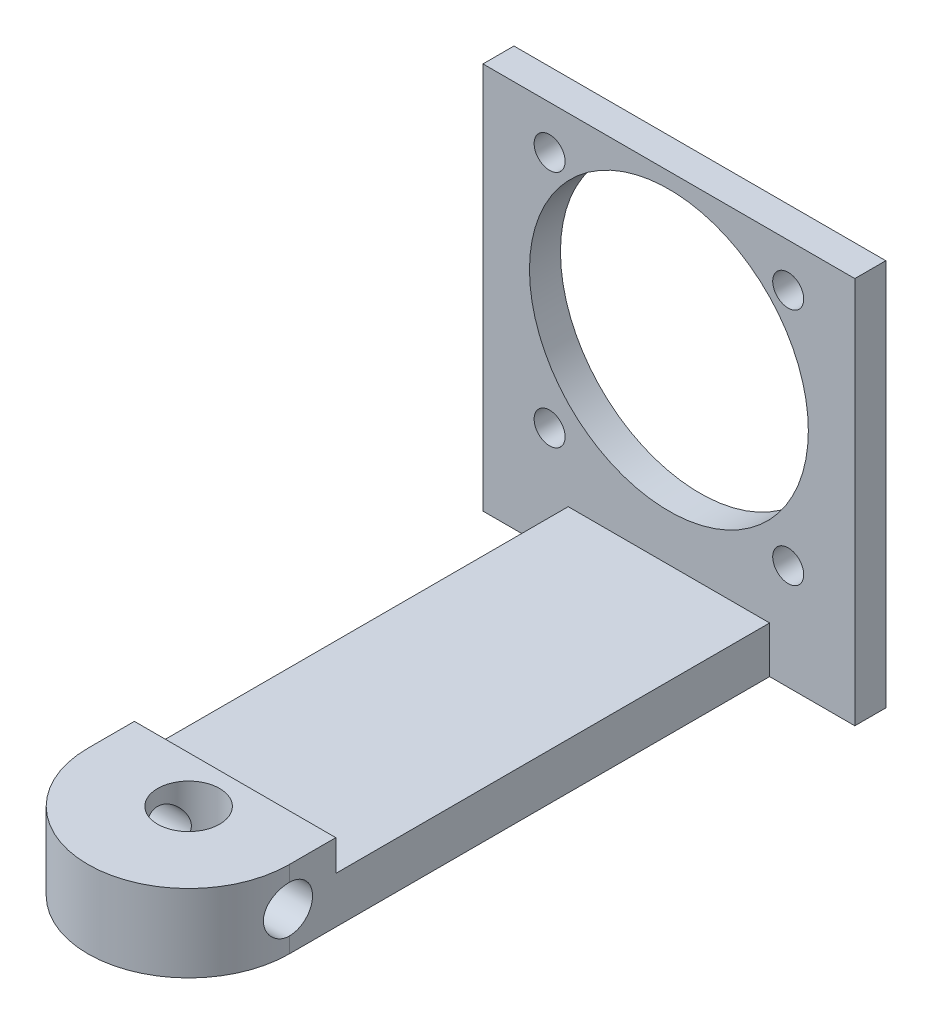
ISO-10303-21;
HEADER;
FILE_DESCRIPTION(('STEP AP214'),'2;1');
FILE_NAME('part.step','',(''),(''),'','','');
FILE_SCHEMA(('AUTOMOTIVE_DESIGN { 1 0 10303 214 1 1 1 1 }'));
ENDSEC;
DATA;
#1=APPLICATION_CONTEXT('core data for automotive mechanical design processes');
#2=APPLICATION_PROTOCOL_DEFINITION('international standard','automotive_design',2000,#1);
#3=PRODUCT_CONTEXT('',#1,'mechanical');
#4=PRODUCT('Part','Part','',(#3));
#5=PRODUCT_RELATED_PRODUCT_CATEGORY('part','',(#4));
#6=PRODUCT_DEFINITION_FORMATION('','',#4);
#7=PRODUCT_DEFINITION_CONTEXT('part definition',#1,'design');
#8=PRODUCT_DEFINITION('design','',#6,#7);
#9=PRODUCT_DEFINITION_SHAPE('','',#8);
#10=(LENGTH_UNIT() NAMED_UNIT(*) SI_UNIT(.MILLI.,.METRE.));
#11=(NAMED_UNIT(*) PLANE_ANGLE_UNIT() SI_UNIT($,.RADIAN.));
#12=(NAMED_UNIT(*) SI_UNIT($,.STERADIAN.) SOLID_ANGLE_UNIT());
#13=UNCERTAINTY_MEASURE_WITH_UNIT(LENGTH_MEASURE(1.E-05),#10,'distance_accuracy_value','');
#14=(GEOMETRIC_REPRESENTATION_CONTEXT(3) GLOBAL_UNCERTAINTY_ASSIGNED_CONTEXT((#13)) GLOBAL_UNIT_ASSIGNED_CONTEXT((#10,
#11,#12)) REPRESENTATION_CONTEXT('',''));
#15=CARTESIAN_POINT('',(0.,0.,0.));
#16=DIRECTION('',(0.,0.,1.));
#17=DIRECTION('',(1.,0.,0.));
#18=AXIS2_PLACEMENT_3D('',#15,#16,#17);
#19=CARTESIAN_POINT('',(0.,5.,0.));
#20=DIRECTION('',(0.,-1.,0.));
#21=DIRECTION('',(0.,0.,-1.));
#22=AXIS2_PLACEMENT_3D('',#19,#20,#21);
#23=CYLINDRICAL_SURFACE('',#22,6.5);
#24=DIRECTION('',(0.,1.,0.));
#25=VECTOR('',#24,1.);
#26=CARTESIAN_POINT('',(-6.5,0.,0.));
#27=LINE('',#26,#25);
#28=CARTESIAN_POINT('',(-6.5,4.,0.));
#29=VERTEX_POINT('',#28);
#30=CARTESIAN_POINT('',(-6.5,5.,0.));
#31=VERTEX_POINT('',#30);
#32=EDGE_CURVE('E256',#29,#31,#27,.T.);
#33=ORIENTED_EDGE('',*,*,#32,.F.);
#34=CARTESIAN_POINT('',(-6.5,4.,0.));
#35=CARTESIAN_POINT('',(-6.50000220165452,4.00000034953334,0.0416147872954959));
#36=CARTESIAN_POINT('',(-6.49959986400161,3.99826710539507,0.0832091199490759));
#37=CARTESIAN_POINT('',(-6.49800953430171,3.99135662834144,0.166089757544733));
#38=CARTESIAN_POINT('',(-6.49682165266363,3.98617987941311,0.207376104949849));
#39=CARTESIAN_POINT('',(-6.49212286566449,3.96555451840419,0.330175317789648));
#40=CARTESIAN_POINT('',(-6.48747657447072,3.94501050646884,0.410849123483653));
#41=CARTESIAN_POINT('',(-6.47565784186475,3.89098207029547,0.567489317574778));
#42=CARTESIAN_POINT('',(-6.46848532076805,3.85749723786392,0.643455557392986));
#43=CARTESIAN_POINT('',(-6.45238470693778,3.77857602400352,0.7887168337292));
#44=CARTESIAN_POINT('',(-6.44345630747166,3.73313755393742,0.858010701502618));
#45=CARTESIAN_POINT('',(-6.42464362628356,3.63075675821594,0.989150748038431));
#46=CARTESIAN_POINT('',(-6.41474648283068,3.57364419902096,1.05086213099954));
#47=CARTESIAN_POINT('',(-6.39519936402326,3.44989542172784,1.16392621182314));
#48=CARTESIAN_POINT('',(-6.38554943278192,3.38325751766964,1.21527707201301));
#49=CARTESIAN_POINT('',(-6.36746150102323,3.2413311694577,1.30676825801418));
#50=CARTESIAN_POINT('',(-6.35904004454769,3.1659455490244,1.34676139941763));
#51=CARTESIAN_POINT('',(-6.34455013648216,3.00930058518296,1.41345535385357));
#52=CARTESIAN_POINT('',(-6.33848124461369,2.92804234420635,1.4401586543231));
#53=CARTESIAN_POINT('',(-6.32951539761228,2.76343513777675,1.47906402551188));
#54=CARTESIAN_POINT('',(-6.32656563823779,2.68014624207401,1.49150781160661));
#55=CARTESIAN_POINT('',(-6.32401364085923,2.51261284883344,1.50229310584037));
#56=CARTESIAN_POINT('',(-6.32441101948296,2.42836846183881,1.50063622903126));
#57=CARTESIAN_POINT('',(-6.32846084145958,2.26313685146556,1.48346059952456));
#58=CARTESIAN_POINT('',(-6.33204664255201,2.18211824518399,1.46822563187731));
#59=CARTESIAN_POINT('',(-6.34196356616616,2.02381956619207,1.4247771750235));
#60=CARTESIAN_POINT('',(-6.34829483549844,1.94653969365162,1.39656299176435));
#61=CARTESIAN_POINT('',(-6.36305342295416,1.79712631388062,1.32770304404165));
#62=CARTESIAN_POINT('',(-6.37149866245093,1.72504396921276,1.28695026840391));
#63=CARTESIAN_POINT('',(-6.38952265626135,1.58863901043529,1.1942459969747));
#64=CARTESIAN_POINT('',(-6.39910155080027,1.52431735826085,1.14229311515341));
#65=CARTESIAN_POINT('',(-6.41859659909107,1.4036333728504,1.02718049087355));
#66=CARTESIAN_POINT('',(-6.42851532395215,1.34749962191238,0.963781307071192));
#67=CARTESIAN_POINT('',(-6.44736600364968,1.24660761938418,0.82833476980019));
#68=CARTESIAN_POINT('',(-6.45629769992504,1.20185234451434,0.756285160538791));
#69=CARTESIAN_POINT('',(-6.47220381480734,1.12491899722735,0.605275941064463));
#70=CARTESIAN_POINT('',(-6.47917205030647,1.09278053401099,0.526295506847693));
#71=CARTESIAN_POINT('',(-6.49031294619121,1.04233883410384,0.363906168610026));
#72=CARTESIAN_POINT('',(-6.49448971158766,1.02401527672575,0.280503962867058));
#73=CARTESIAN_POINT('',(-6.49802162790796,1.008592607797,0.163668895100916));
#74=CARTESIAN_POINT('',(-6.49876264230996,1.00536952773524,0.130994416113086));
#75=CARTESIAN_POINT('',(-6.49975148978194,1.00107578893315,0.0655516850819211));
#76=CARTESIAN_POINT('',(-6.50000014424018,1.00000154532742,0.0327836807001354));
#77=CARTESIAN_POINT('',(-6.5,0.999999999999993,0.));
#78=B_SPLINE_CURVE_WITH_KNOTS('',3,(#34,#35,#36,#37,#38,#39,#40,#41,#42,#43,#44,#45,#46,#47,#48,
#49,#50,#51,#52,#53,#54,#55,#56,#57,#58,#59,#60,#61,#62,#63,#64,#65,#66,#67,#68,#69,#70,#71,#72,
#73,#74,#75,#76,#77),.UNSPECIFIED.,.F.,.F.,(4,2,2,2,2,2,2,2,2,2,2,2,2,2,2,2,2,2,2,2,2,4),(0.,
0.124766007489179,0.249514482732316,0.49835772355059,0.74720881429561,0.996103415249857,
1.24892599960295,1.50179338840207,1.75780196475339,2.01376260637538,2.26531706657213,
2.51684271478785,2.76323158330048,3.00963362878159,3.25819984550211,3.50679684033752,
3.76137162291094,4.01601293635863,4.2714473969798,4.52650539572824,4.62497109867903,
4.72327239560029),.UNSPECIFIED.);
#79=CARTESIAN_POINT('',(-6.5,1.,0.));
#80=VERTEX_POINT('',#79);
#81=EDGE_CURVE('E88',#29,#80,#78,.T.);
#82=ORIENTED_EDGE('',*,*,#81,.T.);
#83=CARTESIAN_POINT('',(-6.5,0.,0.));
#84=VERTEX_POINT('',#83);
#85=EDGE_CURVE('E261',#84,#80,#27,.T.);
#86=ORIENTED_EDGE('',*,*,#85,.F.);
#87=CARTESIAN_POINT('',(0.,0.,0.));
#88=DIRECTION('',(0.,1.,0.));
#89=DIRECTION('',(0.,0.,1.));
#90=AXIS2_PLACEMENT_3D('',#87,#88,#89);
#91=CIRCLE('',#90,6.5);
#92=CARTESIAN_POINT('',(6.5,0.,0.));
#93=VERTEX_POINT('',#92);
#94=EDGE_CURVE('E276',#84,#93,#91,.T.);
#95=ORIENTED_EDGE('',*,*,#94,.T.);
#96=DIRECTION('',(0.,1.,0.));
#97=VECTOR('',#96,1.);
#98=CARTESIAN_POINT('',(6.5,0.,0.));
#99=LINE('',#98,#97);
#100=CARTESIAN_POINT('',(6.5,1.,0.));
#101=VERTEX_POINT('',#100);
#102=EDGE_CURVE('E270',#93,#101,#99,.T.);
#103=ORIENTED_EDGE('',*,*,#102,.T.);
#104=CARTESIAN_POINT('',(6.5,1.,0.));
#105=CARTESIAN_POINT('',(6.50000220165452,0.999999650466661,0.0416147872954943));
#106=CARTESIAN_POINT('',(6.49959986400161,1.00173289460494,0.0832091199490743));
#107=CARTESIAN_POINT('',(6.49800953430171,1.00864337165856,0.166089757544732));
#108=CARTESIAN_POINT('',(6.49682165266363,1.01382012058689,0.207376104949847));
#109=CARTESIAN_POINT('',(6.49212286566449,1.03444548159581,0.330175317789646));
#110=CARTESIAN_POINT('',(6.48747657447072,1.05498949353116,0.410849123483651));
#111=CARTESIAN_POINT('',(6.47565784186475,1.10901792970453,0.567489317574776));
#112=CARTESIAN_POINT('',(6.46848532076805,1.14250276213608,0.643455557392984));
#113=CARTESIAN_POINT('',(6.45238470693778,1.22142397599648,0.788716833729199));
#114=CARTESIAN_POINT('',(6.44345630747166,1.26686244606258,0.858010701502617));
#115=CARTESIAN_POINT('',(6.42464362628356,1.36924324178406,0.98915074803843));
#116=CARTESIAN_POINT('',(6.41474648283068,1.42635580097904,1.05086213099954));
#117=CARTESIAN_POINT('',(6.39519936402326,1.55010457827216,1.16392621182314));
#118=CARTESIAN_POINT('',(6.38554943278192,1.61674248233036,1.215277072013));
#119=CARTESIAN_POINT('',(6.36746150102323,1.75866883054229,1.30676825801418));
#120=CARTESIAN_POINT('',(6.35904004454769,1.8340544509756,1.34676139941763));
#121=CARTESIAN_POINT('',(6.34455013648216,1.99069941481704,1.41345535385357));
#122=CARTESIAN_POINT('',(6.33848124461369,2.07195765579365,1.4401586543231));
#123=CARTESIAN_POINT('',(6.32951539761228,2.23656486222325,1.47906402551188));
#124=CARTESIAN_POINT('',(6.32656563823779,2.31985375792599,1.49150781160661));
#125=CARTESIAN_POINT('',(6.32401364085923,2.48738715116656,1.50229310584037));
#126=CARTESIAN_POINT('',(6.32441101948296,2.57163153816119,1.50063622903126));
#127=CARTESIAN_POINT('',(6.32846084145958,2.73686314853444,1.48346059952456));
#128=CARTESIAN_POINT('',(6.33204664255201,2.81788175481601,1.46822563187731));
#129=CARTESIAN_POINT('',(6.34196356616616,2.97618043380792,1.4247771750235));
#130=CARTESIAN_POINT('',(6.34829483549844,3.05346030634837,1.39656299176435));
#131=CARTESIAN_POINT('',(6.36305342295416,3.20287368611938,1.32770304404165));
#132=CARTESIAN_POINT('',(6.37149866245093,3.27495603078724,1.28695026840391));
#133=CARTESIAN_POINT('',(6.38952265626135,3.41136098956471,1.1942459969747));
#134=CARTESIAN_POINT('',(6.39910155080027,3.47568264173915,1.14229311515341));
#135=CARTESIAN_POINT('',(6.41859659909107,3.5963666271496,1.02718049087355));
#136=CARTESIAN_POINT('',(6.42851532395215,3.65250037808762,0.963781307071193));
#137=CARTESIAN_POINT('',(6.44736600364968,3.75339238061581,0.828334769800191));
#138=CARTESIAN_POINT('',(6.45629769992504,3.79814765548566,0.756285160538792));
#139=CARTESIAN_POINT('',(6.47220381480734,3.87508100277265,0.605275941064464));
#140=CARTESIAN_POINT('',(6.47917205030647,3.90721946598901,0.526295506847694));
#141=CARTESIAN_POINT('',(6.49031294619121,3.95766116589616,0.363906168610028));
#142=CARTESIAN_POINT('',(6.49448971158766,3.97598472327425,0.28050396286706));
#143=CARTESIAN_POINT('',(6.49802162790796,3.991407392203,0.163668895100917));
#144=CARTESIAN_POINT('',(6.49876264230996,3.99463047226476,0.130994416113087));
#145=CARTESIAN_POINT('',(6.49975148978194,3.99892421106685,0.0655516850819207));
#146=CARTESIAN_POINT('',(6.50000014424018,3.99999845467258,0.0327836807001345));
#147=CARTESIAN_POINT('',(6.5,4.00000000000001,0.));
#148=B_SPLINE_CURVE_WITH_KNOTS('',3,(#104,#105,#106,#107,#108,#109,#110,#111,#112,#113,#114,
#115,#116,#117,#118,#119,#120,#121,#122,#123,#124,#125,#126,#127,#128,#129,#130,#131,#132,#133,
#134,#135,#136,#137,#138,#139,#140,#141,#142,#143,#144,#145,#146,#147),.UNSPECIFIED.,.F.,.F.,(4,
2,2,2,2,2,2,2,2,2,2,2,2,2,2,2,2,2,2,2,2,4),(0.,0.124766007489179,0.249514482732316,
0.49835772355059,0.74720881429561,0.996103415249857,1.24892599960295,1.50179338840207,
1.75780196475339,2.01376260637538,2.26531706657213,2.51684271478785,2.76323158330048,
3.00963362878159,3.25819984550211,3.50679684033752,3.76137162291094,4.01601293635863,
4.2714473969798,4.52650539572824,4.62497109867903,4.72327239560029),.UNSPECIFIED.);
#149=CARTESIAN_POINT('',(6.5,4.,0.));
#150=VERTEX_POINT('',#149);
#151=EDGE_CURVE('E81',#101,#150,#148,.T.);
#152=ORIENTED_EDGE('',*,*,#151,.T.);
#153=CARTESIAN_POINT('',(6.5,5.,0.));
#154=VERTEX_POINT('',#153);
#155=EDGE_CURVE('E266',#150,#154,#99,.T.);
#156=ORIENTED_EDGE('',*,*,#155,.T.);
#157=CARTESIAN_POINT('',(0.,5.,0.));
#158=DIRECTION('',(0.,1.,0.));
#159=DIRECTION('',(0.,0.,1.));
#160=AXIS2_PLACEMENT_3D('',#157,#158,#159);
#161=CIRCLE('',#160,6.5);
#162=EDGE_CURVE('E75',#31,#154,#161,.T.);
#163=ORIENTED_EDGE('',*,*,#162,.F.);
#164=EDGE_LOOP('',(#33,#82,#86,#95,#103,#152,#156,#163));
#165=FACE_BOUND('',#164,.T.);
#166=ADVANCED_FACE('F66',(#165),#23,.T.);
#167=CARTESIAN_POINT('',(0.,5.,0.));
#168=DIRECTION('',(0.,1.,0.));
#169=DIRECTION('',(0.,0.,1.));
#170=AXIS2_PLACEMENT_3D('',#167,#168,#169);
#171=PLANE('',#170);
#172=DIRECTION('',(1.,0.,0.));
#173=VECTOR('',#172,1.);
#174=CARTESIAN_POINT('',(-6.5,5.,-3.));
#175=LINE('',#174,#173);
#176=CARTESIAN_POINT('',(-6.5,5.,-3.));
#177=VERTEX_POINT('',#176);
#178=CARTESIAN_POINT('',(6.5,5.,-3.));
#179=VERTEX_POINT('',#178);
#180=EDGE_CURVE('E176',#177,#179,#175,.T.);
#181=ORIENTED_EDGE('',*,*,#180,.F.);
#182=DIRECTION('',(0.,0.,-1.));
#183=VECTOR('',#182,1.);
#184=CARTESIAN_POINT('',(-6.5,5.,0.));
#185=LINE('',#184,#183);
#186=EDGE_CURVE('E181',#31,#177,#185,.T.);
#187=ORIENTED_EDGE('',*,*,#186,.F.);
#188=ORIENTED_EDGE('',*,*,#162,.T.);
#189=DIRECTION('',(0.,0.,-1.));
#190=VECTOR('',#189,1.);
#191=CARTESIAN_POINT('',(6.5,5.,0.));
#192=LINE('',#191,#190);
#193=EDGE_CURVE('E300',#154,#179,#192,.T.);
#194=ORIENTED_EDGE('',*,*,#193,.T.);
#195=EDGE_LOOP('',(#181,#187,#188,#194));
#196=FACE_BOUND('',#195,.T.);
#197=CARTESIAN_POINT('',(0.,5.,0.));
#198=DIRECTION('',(0.,1.,0.));
#199=DIRECTION('',(0.,0.,1.));
#200=AXIS2_PLACEMENT_3D('',#197,#198,#199);
#201=CIRCLE('',#200,2.);
#202=CARTESIAN_POINT('',(0.,5.,2.));
#203=VERTEX_POINT('',#202);
#204=EDGE_CURVE('E277',#203,#203,#201,.T.);
#205=ORIENTED_EDGE('',*,*,#204,.F.);
#206=EDGE_LOOP('',(#205));
#207=FACE_BOUND('',#206,.T.);
#208=ADVANCED_FACE('F239',(#196,#207),#171,.T.);
#209=CARTESIAN_POINT('',(0.,0.,0.));
#210=DIRECTION('',(0.,1.,0.));
#211=DIRECTION('',(0.,0.,1.));
#212=AXIS2_PLACEMENT_3D('',#209,#210,#211);
#213=PLANE('',#212);
#214=CARTESIAN_POINT('',(0.,0.,0.));
#215=DIRECTION('',(0.,1.,0.));
#216=DIRECTION('',(0.,0.,1.));
#217=AXIS2_PLACEMENT_3D('',#214,#215,#216);
#218=CIRCLE('',#217,2.);
#219=CARTESIAN_POINT('',(0.,0.,2.));
#220=VERTEX_POINT('',#219);
#221=EDGE_CURVE('E273',#220,#220,#218,.T.);
#222=ORIENTED_EDGE('',*,*,#221,.T.);
#223=EDGE_LOOP('',(#222));
#224=FACE_BOUND('',#223,.T.);
#225=ORIENTED_EDGE('',*,*,#94,.F.);
#226=DIRECTION('',(0.,0.,-1.));
#227=VECTOR('',#226,1.);
#228=CARTESIAN_POINT('',(-6.5,0.,0.));
#229=LINE('',#228,#227);
#230=CARTESIAN_POINT('',(-6.5,0.,-31.));
#231=VERTEX_POINT('',#230);
#232=EDGE_CURVE('E297',#84,#231,#229,.T.);
#233=ORIENTED_EDGE('',*,*,#232,.T.);
#234=DIRECTION('',(-1.,0.,0.));
#235=VECTOR('',#234,1.);
#236=CARTESIAN_POINT('',(0.,0.,-31.));
#237=LINE('',#236,#235);
#238=CARTESIAN_POINT('',(-12.,0.,-31.));
#239=VERTEX_POINT('',#238);
#240=EDGE_CURVE('E316',#231,#239,#237,.T.);
#241=ORIENTED_EDGE('',*,*,#240,.T.);
#242=DIRECTION('',(0.,0.,1.));
#243=VECTOR('',#242,1.);
#244=CARTESIAN_POINT('',(-12.,0.,-33.));
#245=LINE('',#244,#243);
#246=CARTESIAN_POINT('',(-12.,0.,-33.));
#247=VERTEX_POINT('',#246);
#248=EDGE_CURVE('E306',#247,#239,#245,.T.);
#249=ORIENTED_EDGE('',*,*,#248,.F.);
#250=DIRECTION('',(-1.,0.,0.));
#251=VECTOR('',#250,1.);
#252=CARTESIAN_POINT('',(12.,0.,-33.));
#253=LINE('',#252,#251);
#254=CARTESIAN_POINT('',(12.,0.,-33.));
#255=VERTEX_POINT('',#254);
#256=EDGE_CURVE('E344',#255,#247,#253,.T.);
#257=ORIENTED_EDGE('',*,*,#256,.F.);
#258=DIRECTION('',(0.,0.,1.));
#259=VECTOR('',#258,1.);
#260=CARTESIAN_POINT('',(12.,0.,-33.));
#261=LINE('',#260,#259);
#262=CARTESIAN_POINT('',(12.,0.,-31.));
#263=VERTEX_POINT('',#262);
#264=EDGE_CURVE('E345',#255,#263,#261,.T.);
#265=ORIENTED_EDGE('',*,*,#264,.T.);
#266=CARTESIAN_POINT('',(6.5,0.,-31.));
#267=VERTEX_POINT('',#266);
#268=EDGE_CURVE('E295',#263,#267,#237,.T.);
#269=ORIENTED_EDGE('',*,*,#268,.T.);
#270=DIRECTION('',(0.,0.,-1.));
#271=VECTOR('',#270,1.);
#272=CARTESIAN_POINT('',(6.5,0.,0.));
#273=LINE('',#272,#271);
#274=EDGE_CURVE('E267',#93,#267,#273,.T.);
#275=ORIENTED_EDGE('',*,*,#274,.F.);
#276=EDGE_LOOP('',(#225,#233,#241,#249,#257,#265,#269,#275));
#277=FACE_BOUND('',#276,.T.);
#278=ADVANCED_FACE('F236',(#224,#277),#213,.F.);
#279=CARTESIAN_POINT('',(0.,0.,0.));
#280=DIRECTION('',(0.,1.,0.));
#281=DIRECTION('',(0.,0.,1.));
#282=AXIS2_PLACEMENT_3D('',#279,#280,#281);
#283=CYLINDRICAL_SURFACE('',#282,2.);
#284=CARTESIAN_POINT('',(-1.3228756555323,2.5,-1.5));
#285=CARTESIAN_POINT('',(-1.32289190044095,2.43000257657437,-1.49999219049447));
#286=CARTESIAN_POINT('',(-1.32856366615417,2.35995416568808,-1.4950410907442));
#287=CARTESIAN_POINT('',(-1.34990644032802,2.22267014379052,-1.47578333210409));
#288=CARTESIAN_POINT('',(-1.3656072516867,2.15544355498049,-1.46144878565587));
#289=CARTESIAN_POINT('',(-1.40375127916871,2.02642015326162,-1.42483838991846));
#290=CARTESIAN_POINT('',(-1.42609848244814,1.96456122323754,-1.40267483444956));
#291=CARTESIAN_POINT('',(-1.47486455031267,1.84565454555481,-1.35130655299363));
#292=CARTESIAN_POINT('',(-1.50128292264932,1.78860621753078,-1.3221026780169));
#293=CARTESIAN_POINT('',(-1.56177312961147,1.66788720368341,-1.25039909811054));
#294=CARTESIAN_POINT('',(-1.59628904009787,1.60533206577352,-1.20639573950363));
#295=CARTESIAN_POINT('',(-1.66521164096379,1.48747453375773,-1.10933596759308));
#296=CARTESIAN_POINT('',(-1.69961809339876,1.43218303517973,-1.05626622282799));
#297=CARTESIAN_POINT('',(-1.77262582436251,1.31914126134453,-0.929610192252512));
#298=CARTESIAN_POINT('',(-1.81064921229759,1.26319403328014,-0.854047289142162));
#299=CARTESIAN_POINT('',(-1.87882809751632,1.16537779171716,-0.691189714821938));
#300=CARTESIAN_POINT('',(-1.90900204180106,1.12347570253119,-0.603923293836165));
#301=CARTESIAN_POINT('',(-1.95034258990248,1.06679231409706,-0.447869023983643));
#302=CARTESIAN_POINT('',(-1.96449710921006,1.04764290402153,-0.381446049692534));
#303=CARTESIAN_POINT('',(-1.98605635937555,1.01860988400325,-0.24555260931654));
#304=CARTESIAN_POINT('',(-1.99346695432364,1.00871822389326,-0.176084845995168));
#305=CARTESIAN_POINT('',(-2.00091375578087,0.998778266137508,-0.035865092622026));
#306=CARTESIAN_POINT('',(-2.00093080057495,0.998755545623561,0.0348897591186407));
#307=CARTESIAN_POINT('',(-1.99354206503066,1.00861793678029,0.175316156674038));
#308=CARTESIAN_POINT('',(-1.98613456571337,1.01850534290814,0.244987447822228));
#309=CARTESIAN_POINT('',(-1.96491377944411,1.04708105058987,0.378889193792653));
#310=CARTESIAN_POINT('',(-1.9513285776568,1.06545632638708,0.443224268236297));
#311=CARTESIAN_POINT('',(-1.91882278657017,1.10999564218224,0.567680485046398));
#312=CARTESIAN_POINT('',(-1.89990103394193,1.13616138051316,0.627800705033637));
#313=CARTESIAN_POINT('',(-1.85561045984504,1.19852961514532,0.749216921864731));
#314=CARTESIAN_POINT('',(-1.82976540608097,1.23551209661876,0.8099353847136));
#315=CARTESIAN_POINT('',(-1.77460702483739,1.31673370397051,0.924567250548285));
#316=CARTESIAN_POINT('',(-1.74529074780453,1.3609790136999,0.978474784621222));
#317=CARTESIAN_POINT('',(-1.6789376587236,1.46522334882094,1.08908204283329));
#318=CARTESIAN_POINT('',(-1.64151655866368,1.5266092100264,1.14424493004784));
#319=CARTESIAN_POINT('',(-1.56725958283769,1.65783458362194,1.24400875556228));
#320=CARTESIAN_POINT('',(-1.53042399363523,1.72767809952506,1.28860466211477));
#321=CARTESIAN_POINT('',(-1.46819425999159,1.86098187024563,1.35873206411601));
#322=CARTESIAN_POINT('',(-1.44197599789983,1.92298704530065,1.38628866868103));
#323=CARTESIAN_POINT('',(-1.39536741257394,2.05206528141938,1.43319397108784));
#324=CARTESIAN_POINT('',(-1.37496395320511,2.11912647969037,1.45256121808259));
#325=CARTESIAN_POINT('',(-1.34640050620232,2.24368694399832,1.47902385350669));
#326=CARTESIAN_POINT('',(-1.3366153955687,2.30044708211686,1.48779069496582));
#327=CARTESIAN_POINT('',(-1.32435588438334,2.41535546617383,1.49871760619789));
#328=CARTESIAN_POINT('',(-1.32187213058307,2.47350183990282,1.50088612873266));
#329=CARTESIAN_POINT('',(-1.32462868790497,2.5894789917334,1.49845270115552));
#330=CARTESIAN_POINT('',(-1.32987184207164,2.64730964580967,1.4938482589949));
#331=CARTESIAN_POINT('',(-1.34721218775046,2.76107615244287,1.47822527271969));
#332=CARTESIAN_POINT('',(-1.35932107727345,2.8170085979481,1.46719578056394));
#333=CARTESIAN_POINT('',(-1.39427758287802,2.94633804493887,1.43413959562387));
#334=CARTESIAN_POINT('',(-1.41944823697315,3.01843595391503,1.40954189769242));
#335=CARTESIAN_POINT('',(-1.47537861079975,3.15630766364012,1.35088877838435));
#336=CARTESIAN_POINT('',(-1.5061485847723,3.22206951729475,1.31681594335477));
#337=CARTESIAN_POINT('',(-1.5710828237565,3.34934900804812,1.23869774116696));
#338=CARTESIAN_POINT('',(-1.60532883846046,3.41063287621826,1.19434110060341));
#339=CARTESIAN_POINT('',(-1.67347506272361,3.52600209636125,1.09682562914592));
#340=CARTESIAN_POINT('',(-1.70737509574665,3.58008392798894,1.04366252194463));
#341=CARTESIAN_POINT('',(-1.77960222623532,3.69127699162937,0.916234513829621));
#342=CARTESIAN_POINT('',(-1.81728174165357,3.7464752388576,0.839896270946856));
#343=CARTESIAN_POINT('',(-1.88453104769825,3.84262073345087,0.675551612651267));
#344=CARTESIAN_POINT('',(-1.91411836052283,3.88359882458129,0.58757102997485));
#345=CARTESIAN_POINT('',(-1.95419406402379,3.93843799144687,0.43075566149691));
#346=CARTESIAN_POINT('',(-1.9677547802964,3.95675679327544,0.364250057327472));
#347=CARTESIAN_POINT('',(-1.98810265589123,3.98412879630752,0.228364464964351));
#348=CARTESIAN_POINT('',(-1.9948958710696,3.99319028154851,0.158987104561942));
#349=CARTESIAN_POINT('',(-2.00113566717062,4.0015163909286,0.0191476059403982));
#350=CARTESIAN_POINT('',(-2.00056500218907,4.00075801734824,-0.051316692587088));
#351=CARTESIAN_POINT('',(-1.9920880324381,3.98943900869876,-0.191009011030081));
#352=CARTESIAN_POINT('',(-1.98417977344351,3.97887576229252,-0.260236696591289));
#353=CARTESIAN_POINT('',(-1.96203400925195,3.94902508383276,-0.393521935254972));
#354=CARTESIAN_POINT('',(-1.94798690792879,3.92999981867845,-0.457671236511442));
#355=CARTESIAN_POINT('',(-1.91462720575136,3.88421193438106,-0.581661343097389));
#356=CARTESIAN_POINT('',(-1.89531347862386,3.85744766016908,-0.641501223388815));
#357=CARTESIAN_POINT('',(-1.8501764221064,3.79372206240403,-0.762547698766813));
#358=CARTESIAN_POINT('',(-1.82386352707581,3.75594906864041,-0.823141236713419));
#359=CARTESIAN_POINT('',(-1.76785506075717,3.67313355944579,-0.937414811724215));
#360=CARTESIAN_POINT('',(-1.73815638795658,3.62808436271395,-0.991088412383374));
#361=CARTESIAN_POINT('',(-1.67106353042106,3.52199463343921,-1.10112380660681));
#362=CARTESIAN_POINT('',(-1.63330922504697,3.45955360056009,-1.15591691541996));
#363=CARTESIAN_POINT('',(-1.55866082463332,3.32613192810012,-1.2547525342935));
#364=CARTESIAN_POINT('',(-1.52176704921892,3.25514817396343,-1.29879110556729));
#365=CARTESIAN_POINT('',(-1.46049601449284,3.12111674940969,-1.36695971301455));
#366=CARTESIAN_POINT('',(-1.43513625007637,3.05966501729344,-1.39333526337998));
#367=CARTESIAN_POINT('',(-1.39032564651232,2.93191708694412,-1.43805398028599));
#368=CARTESIAN_POINT('',(-1.37085915899696,2.86563430840455,-1.45641847678344));
#369=CARTESIAN_POINT('',(-1.34532423383262,2.74921178040307,-1.4799705775638));
#370=CARTESIAN_POINT('',(-1.3370013026568,2.70003292870953,-1.48744249026866));
#371=CARTESIAN_POINT('',(-1.32577295392455,2.60057766696634,-1.49745839072448));
#372=CARTESIAN_POINT('',(-1.32286398151146,2.55030199905627,-1.50000561211714));
#373=CARTESIAN_POINT('',(-1.3228756555323,2.5,-1.5));
#374=B_SPLINE_CURVE_WITH_KNOTS('',3,(#284,#285,#286,#287,#288,#289,#290,#291,#292,#293,#294,
#295,#296,#297,#298,#299,#300,#301,#302,#303,#304,#305,#306,#307,#308,#309,#310,#311,#312,#313,
#314,#315,#316,#317,#318,#319,#320,#321,#322,#323,#324,#325,#326,#327,#328,#329,#330,#331,#332,
#333,#334,#335,#336,#337,#338,#339,#340,#341,#342,#343,#344,#345,#346,#347,#348,#349,#350,#351,
#352,#353,#354,#355,#356,#357,#358,#359,#360,#361,#362,#363,#364,#365,#366,#367,#368,#369,#370,
#371,#372,#373),.UNSPECIFIED.,.T.,.F.,(4,2,2,2,2,2,2,2,2,2,2,2,2,2,2,2,2,2,2,2,2,2,2,2,2,2,2,2,
2,2,2,2,2,2,2,2,2,2,2,2,2,2,2,2,4),(0.,0.20973177668449,0.420089722582994,0.627545385620139,
0.834975984672345,1.08585208691169,1.33710031031849,1.63964848103538,1.94147907444963,
2.15227725277555,2.36289195870711,2.57405250727807,2.78526195641288,2.9892375589505,
3.19325766108669,3.41936844116895,3.64567274887663,3.91649517204702,4.18744629647933,
4.40499409477197,4.62204646613006,4.79608005545901,4.96989060538193,5.14376512326213,
5.31793678696019,5.55730028202397,5.79710662639151,6.0454320909006,6.29387849446618,
6.59652499511463,6.89851088586565,7.10852896194427,7.31835893539181,7.52868041101043,
7.73905791773945,7.94332812691912,8.14764205379332,8.3751005248961,8.60276905744644,
8.87547580578155,9.14828228208531,9.36218279640835,9.57551025772699,9.72632812073766,
9.87704692032409),.UNSPECIFIED.);
#375=CARTESIAN_POINT('',(-1.3228756555323,2.5,-1.5));
#376=VERTEX_POINT('',#375);
#377=EDGE_CURVE('E225',#376,#376,#374,.T.);
#378=ORIENTED_EDGE('',*,*,#377,.T.);
#379=EDGE_LOOP('',(#378));
#380=FACE_BOUND('',#379,.T.);
#381=CARTESIAN_POINT('',(1.3228756555323,2.5,-1.5));
#382=CARTESIAN_POINT('',(1.32289190044095,2.56999742342563,-1.49999219049447));
#383=CARTESIAN_POINT('',(1.32856366615417,2.64004583431192,-1.4950410907442));
#384=CARTESIAN_POINT('',(1.34990644032802,2.77732985620948,-1.47578333210409));
#385=CARTESIAN_POINT('',(1.3656072516867,2.84455644501951,-1.46144878565587));
#386=CARTESIAN_POINT('',(1.40375127916871,2.97357984673838,-1.42483838991846));
#387=CARTESIAN_POINT('',(1.42609848244814,3.03543877676246,-1.40267483444956));
#388=CARTESIAN_POINT('',(1.47486455031267,3.15434545444519,-1.35130655299363));
#389=CARTESIAN_POINT('',(1.50128292264932,3.21139378246922,-1.3221026780169));
#390=CARTESIAN_POINT('',(1.56177312961147,3.33211279631659,-1.25039909811054));
#391=CARTESIAN_POINT('',(1.59628904009787,3.39466793422648,-1.20639573950363));
#392=CARTESIAN_POINT('',(1.66521164096379,3.51252546624227,-1.10933596759308));
#393=CARTESIAN_POINT('',(1.69961809339876,3.56781696482027,-1.05626622282799));
#394=CARTESIAN_POINT('',(1.77262582436251,3.68085873865547,-0.929610192252513));
#395=CARTESIAN_POINT('',(1.81064921229759,3.73680596671986,-0.854047289142162));
#396=CARTESIAN_POINT('',(1.87882809751632,3.83462220828284,-0.691189714821939));
#397=CARTESIAN_POINT('',(1.90900204180106,3.87652429746881,-0.603923293836166));
#398=CARTESIAN_POINT('',(1.95034258990248,3.93320768590294,-0.447869023983644));
#399=CARTESIAN_POINT('',(1.96449710921006,3.95235709597847,-0.381446049692536));
#400=CARTESIAN_POINT('',(1.98605635937555,3.98139011599675,-0.245552609316542));
#401=CARTESIAN_POINT('',(1.99346695432364,3.99128177610674,-0.176084845995169));
#402=CARTESIAN_POINT('',(2.00091375578087,4.00122173386249,-0.0358650926220272));
#403=CARTESIAN_POINT('',(2.00093080057496,4.00124445437644,0.0348897591186395));
#404=CARTESIAN_POINT('',(1.99354206503066,3.99138206321971,0.175316156674037));
#405=CARTESIAN_POINT('',(1.98613456571337,3.98149465709186,0.244987447822227));
#406=CARTESIAN_POINT('',(1.96491377944411,3.95291894941013,0.378889193792651));
#407=CARTESIAN_POINT('',(1.9513285776568,3.93454367361293,0.443224268236295));
#408=CARTESIAN_POINT('',(1.91882278657017,3.89000435781777,0.567680485046397));
#409=CARTESIAN_POINT('',(1.89990103394193,3.86383861948684,0.627800705033636));
#410=CARTESIAN_POINT('',(1.85561045984504,3.80147038485469,0.74921692186473));
#411=CARTESIAN_POINT('',(1.82976540608097,3.76448790338124,0.809935384713599));
#412=CARTESIAN_POINT('',(1.77460702483739,3.68326629602949,0.924567250548284));
#413=CARTESIAN_POINT('',(1.74529074780453,3.6390209863001,0.978474784621221));
#414=CARTESIAN_POINT('',(1.6789376587236,3.53477665117906,1.08908204283329));
#415=CARTESIAN_POINT('',(1.64151655866368,3.4733907899736,1.14424493004784));
#416=CARTESIAN_POINT('',(1.56725958283769,3.34216541637806,1.24400875556228));
#417=CARTESIAN_POINT('',(1.53042399363524,3.27232190047494,1.28860466211477));
#418=CARTESIAN_POINT('',(1.46819425999159,3.13901812975437,1.35873206411601));
#419=CARTESIAN_POINT('',(1.44197599789983,3.07701295469935,1.38628866868103));
#420=CARTESIAN_POINT('',(1.39536741257394,2.94793471858062,1.43319397108784));
#421=CARTESIAN_POINT('',(1.37496395320511,2.88087352030963,1.45256121808259));
#422=CARTESIAN_POINT('',(1.34640050620232,2.75631305600168,1.47902385350669));
#423=CARTESIAN_POINT('',(1.3366153955687,2.69955291788314,1.48779069496582));
#424=CARTESIAN_POINT('',(1.32435588438334,2.58464453382618,1.49871760619789));
#425=CARTESIAN_POINT('',(1.32187213058307,2.52649816009718,1.50088612873266));
#426=CARTESIAN_POINT('',(1.32462868790497,2.4105210082666,1.49845270115552));
#427=CARTESIAN_POINT('',(1.32987184207164,2.35269035419033,1.4938482589949));
#428=CARTESIAN_POINT('',(1.34721218775046,2.23892384755713,1.47822527271969));
#429=CARTESIAN_POINT('',(1.35932107727345,2.1829914020519,1.46719578056394));
#430=CARTESIAN_POINT('',(1.39427758287802,2.05366195506113,1.43413959562387));
#431=CARTESIAN_POINT('',(1.41944823697315,1.98156404608497,1.40954189769242));
#432=CARTESIAN_POINT('',(1.47537861079975,1.84369233635989,1.35088877838435));
#433=CARTESIAN_POINT('',(1.5061485847723,1.77793048270525,1.31681594335477));
#434=CARTESIAN_POINT('',(1.5710828237565,1.65065099195188,1.23869774116696));
#435=CARTESIAN_POINT('',(1.60532883846046,1.58936712378175,1.19434110060341));
#436=CARTESIAN_POINT('',(1.67347506272361,1.47399790363875,1.09682562914592));
#437=CARTESIAN_POINT('',(1.70737509574665,1.41991607201106,1.04366252194463));
#438=CARTESIAN_POINT('',(1.77960222623532,1.30872300837064,0.916234513829622));
#439=CARTESIAN_POINT('',(1.81728174165357,1.2535247611424,0.839896270946857));
#440=CARTESIAN_POINT('',(1.88453104769825,1.15737926654913,0.675551612651268));
#441=CARTESIAN_POINT('',(1.91411836052283,1.11640117541871,0.587571029974852));
#442=CARTESIAN_POINT('',(1.9541940640238,1.06156200855313,0.430755661496911));
#443=CARTESIAN_POINT('',(1.9677547802964,1.04324320672456,0.364250057327473));
#444=CARTESIAN_POINT('',(1.98810265589123,1.01587120369248,0.228364464964353));
#445=CARTESIAN_POINT('',(1.9948958710696,1.00680971845149,0.158987104561943));
#446=CARTESIAN_POINT('',(2.00113566717062,0.998483609071396,0.0191476059403994));
#447=CARTESIAN_POINT('',(2.00056500218907,0.999241982651755,-0.0513166925870866));
#448=CARTESIAN_POINT('',(1.9920880324381,1.01056099130124,-0.19100901103008));
#449=CARTESIAN_POINT('',(1.98417977344351,1.02112423770748,-0.260236696591288));
#450=CARTESIAN_POINT('',(1.96203400925195,1.05097491616724,-0.393521935254971));
#451=CARTESIAN_POINT('',(1.94798690792879,1.07000018132155,-0.457671236511441));
#452=CARTESIAN_POINT('',(1.91462720575136,1.11578806561894,-0.581661343097389));
#453=CARTESIAN_POINT('',(1.89531347862386,1.14255233983091,-0.641501223388814));
#454=CARTESIAN_POINT('',(1.8501764221064,1.20627793759597,-0.762547698766812));
#455=CARTESIAN_POINT('',(1.82386352707581,1.24405093135959,-0.823141236713417));
#456=CARTESIAN_POINT('',(1.76785506075717,1.32686644055421,-0.937414811724214));
#457=CARTESIAN_POINT('',(1.73815638795658,1.37191563728605,-0.991088412383373));
#458=CARTESIAN_POINT('',(1.67106353042106,1.47800536656079,-1.10112380660681));
#459=CARTESIAN_POINT('',(1.63330922504697,1.5404463994399,-1.15591691541995));
#460=CARTESIAN_POINT('',(1.55866082463332,1.67386807189987,-1.2547525342935));
#461=CARTESIAN_POINT('',(1.52176704921892,1.74485182603656,-1.29879110556728));
#462=CARTESIAN_POINT('',(1.46049601449284,1.87888325059031,-1.36695971301455));
#463=CARTESIAN_POINT('',(1.43513625007637,1.94033498270656,-1.39333526337998));
#464=CARTESIAN_POINT('',(1.39032564651233,2.06808291305588,-1.43805398028599));
#465=CARTESIAN_POINT('',(1.37085915899696,2.13436569159545,-1.45641847678344));
#466=CARTESIAN_POINT('',(1.34532423383262,2.25078821959693,-1.4799705775638));
#467=CARTESIAN_POINT('',(1.3370013026568,2.29996707129047,-1.48744249026866));
#468=CARTESIAN_POINT('',(1.32577295392455,2.39942233303365,-1.49745839072448));
#469=CARTESIAN_POINT('',(1.32286398151146,2.44969800094373,-1.50000561211714));
#470=CARTESIAN_POINT('',(1.3228756555323,2.5,-1.5));
#471=B_SPLINE_CURVE_WITH_KNOTS('',3,(#381,#382,#383,#384,#385,#386,#387,#388,#389,#390,#391,
#392,#393,#394,#395,#396,#397,#398,#399,#400,#401,#402,#403,#404,#405,#406,#407,#408,#409,#410,
#411,#412,#413,#414,#415,#416,#417,#418,#419,#420,#421,#422,#423,#424,#425,#426,#427,#428,#429,
#430,#431,#432,#433,#434,#435,#436,#437,#438,#439,#440,#441,#442,#443,#444,#445,#446,#447,#448,
#449,#450,#451,#452,#453,#454,#455,#456,#457,#458,#459,#460,#461,#462,#463,#464,#465,#466,#467,
#468,#469,#470),.UNSPECIFIED.,.T.,.F.,(4,2,2,2,2,2,2,2,2,2,2,2,2,2,2,2,2,2,2,2,2,2,2,2,2,2,2,2,
2,2,2,2,2,2,2,2,2,2,2,2,2,2,2,2,4),(0.,0.20973177668449,0.420089722582994,0.627545385620138,
0.834975984672345,1.08585208691169,1.33710031031849,1.63964848103538,1.94147907444963,
2.15227725277555,2.36289195870711,2.57405250727806,2.78526195641288,2.9892375589505,
3.19325766108669,3.41936844116895,3.64567274887663,3.91649517204702,4.18744629647933,
4.40499409477196,4.62204646613006,4.79608005545901,4.96989060538193,5.14376512326213,
5.31793678696019,5.55730028202397,5.79710662639151,6.0454320909006,6.29387849446618,
6.59652499511463,6.89851088586565,7.10852896194427,7.31835893539181,7.52868041101043,
7.73905791773945,7.94332812691912,8.14764205379332,8.3751005248961,8.60276905744644,
8.87547580578154,9.14828228208531,9.36218279640835,9.57551025772699,9.72632812073766,
9.87704692032409),.UNSPECIFIED.);
#472=CARTESIAN_POINT('',(1.3228756555323,2.5,-1.5));
#473=VERTEX_POINT('',#472);
#474=EDGE_CURVE('E218',#473,#473,#471,.T.);
#475=ORIENTED_EDGE('',*,*,#474,.T.);
#476=EDGE_LOOP('',(#475));
#477=FACE_BOUND('',#476,.T.);
#478=ORIENTED_EDGE('',*,*,#221,.F.);
#479=EDGE_LOOP('',(#478));
#480=FACE_BOUND('',#479,.T.);
#481=ORIENTED_EDGE('',*,*,#204,.T.);
#482=EDGE_LOOP('',(#481));
#483=FACE_BOUND('',#482,.T.);
#484=ADVANCED_FACE('F230',(#380,#477,#480,#483),#283,.F.);
#485=CARTESIAN_POINT('',(6.5,0.,0.));
#486=DIRECTION('',(1.,0.,0.));
#487=DIRECTION('',(0.,0.,-1.));
#488=AXIS2_PLACEMENT_3D('',#485,#486,#487);
#489=PLANE('',#488);
#490=DIRECTION('',(0.,1.,0.));
#491=VECTOR('',#490,1.);
#492=CARTESIAN_POINT('',(6.5,3.,-3.));
#493=LINE('',#492,#491);
#494=CARTESIAN_POINT('',(6.5,3.,-3.));
#495=VERTEX_POINT('',#494);
#496=EDGE_CURVE('E161',#495,#179,#493,.T.);
#497=ORIENTED_EDGE('',*,*,#496,.T.);
#498=ORIENTED_EDGE('',*,*,#193,.F.);
#499=ORIENTED_EDGE('',*,*,#155,.F.);
#500=CARTESIAN_POINT('',(6.5,2.5,0.));
#501=DIRECTION('',(1.,0.,0.));
#502=DIRECTION('',(0.,0.,-1.));
#503=AXIS2_PLACEMENT_3D('',#500,#501,#502);
#504=CIRCLE('',#503,1.5);
#505=EDGE_CURVE('E197',#101,#150,#504,.T.);
#506=ORIENTED_EDGE('',*,*,#505,.F.);
#507=ORIENTED_EDGE('',*,*,#102,.F.);
#508=ORIENTED_EDGE('',*,*,#274,.T.);
#509=DIRECTION('',(0.,1.,0.));
#510=VECTOR('',#509,1.);
#511=CARTESIAN_POINT('',(6.5,0.,-31.));
#512=LINE('',#511,#510);
#513=CARTESIAN_POINT('',(6.5,3.,-31.));
#514=VERTEX_POINT('',#513);
#515=EDGE_CURVE('E281',#267,#514,#512,.T.);
#516=ORIENTED_EDGE('',*,*,#515,.T.);
#517=DIRECTION('',(0.,0.,-1.));
#518=VECTOR('',#517,1.);
#519=CARTESIAN_POINT('',(6.5,3.,-31.));
#520=LINE('',#519,#518);
#521=EDGE_CURVE('E165',#495,#514,#520,.T.);
#522=ORIENTED_EDGE('',*,*,#521,.F.);
#523=EDGE_LOOP('',(#497,#498,#499,#506,#507,#508,#516,#522));
#524=FACE_BOUND('',#523,.T.);
#525=ADVANCED_FACE('F235',(#524),#489,.T.);
#526=CARTESIAN_POINT('',(-6.5,0.,0.));
#527=DIRECTION('',(1.,0.,0.));
#528=DIRECTION('',(0.,0.,-1.));
#529=AXIS2_PLACEMENT_3D('',#526,#527,#528);
#530=PLANE('',#529);
#531=ORIENTED_EDGE('',*,*,#186,.T.);
#532=DIRECTION('',(0.,1.,0.));
#533=VECTOR('',#532,1.);
#534=CARTESIAN_POINT('',(-6.5,3.,-3.));
#535=LINE('',#534,#533);
#536=CARTESIAN_POINT('',(-6.5,3.,-3.));
#537=VERTEX_POINT('',#536);
#538=EDGE_CURVE('E158',#537,#177,#535,.T.);
#539=ORIENTED_EDGE('',*,*,#538,.F.);
#540=DIRECTION('',(0.,0.,1.));
#541=VECTOR('',#540,1.);
#542=CARTESIAN_POINT('',(-6.5,3.,-31.));
#543=LINE('',#542,#541);
#544=CARTESIAN_POINT('',(-6.5,3.,-31.));
#545=VERTEX_POINT('',#544);
#546=EDGE_CURVE('E166',#545,#537,#543,.T.);
#547=ORIENTED_EDGE('',*,*,#546,.F.);
#548=DIRECTION('',(0.,1.,0.));
#549=VECTOR('',#548,1.);
#550=CARTESIAN_POINT('',(-6.5,0.,-31.));
#551=LINE('',#550,#549);
#552=EDGE_CURVE('E262',#231,#545,#551,.T.);
#553=ORIENTED_EDGE('',*,*,#552,.F.);
#554=ORIENTED_EDGE('',*,*,#232,.F.);
#555=ORIENTED_EDGE('',*,*,#85,.T.);
#556=CARTESIAN_POINT('',(-6.5,2.5,0.));
#557=DIRECTION('',(1.,0.,0.));
#558=DIRECTION('',(0.,0.,-1.));
#559=AXIS2_PLACEMENT_3D('',#556,#557,#558);
#560=CIRCLE('',#559,1.5);
#561=EDGE_CURVE('E12',#80,#29,#560,.T.);
#562=ORIENTED_EDGE('',*,*,#561,.T.);
#563=ORIENTED_EDGE('',*,*,#32,.T.);
#564=EDGE_LOOP('',(#531,#539,#547,#553,#554,#555,#562,#563));
#565=FACE_BOUND('',#564,.T.);
#566=ADVANCED_FACE('F179',(#565),#530,.F.);
#567=CARTESIAN_POINT('',(-12.,0.,-33.));
#568=DIRECTION('',(1.,0.,0.));
#569=DIRECTION('',(0.,0.,-1.));
#570=AXIS2_PLACEMENT_3D('',#567,#568,#569);
#571=PLANE('',#570);
#572=DIRECTION('',(0.,1.,0.));
#573=VECTOR('',#572,1.);
#574=CARTESIAN_POINT('',(-12.,0.,-31.));
#575=LINE('',#574,#573);
#576=CARTESIAN_POINT('',(-12.,25.,-31.));
#577=VERTEX_POINT('',#576);
#578=EDGE_CURVE('E327',#239,#577,#575,.T.);
#579=ORIENTED_EDGE('',*,*,#578,.T.);
#580=DIRECTION('',(0.,0.,1.));
#581=VECTOR('',#580,1.);
#582=CARTESIAN_POINT('',(-12.,25.,-33.));
#583=LINE('',#582,#581);
#584=CARTESIAN_POINT('',(-12.,25.,-33.));
#585=VERTEX_POINT('',#584);
#586=EDGE_CURVE('E331',#585,#577,#583,.T.);
#587=ORIENTED_EDGE('',*,*,#586,.F.);
#588=DIRECTION('',(0.,1.,0.));
#589=VECTOR('',#588,1.);
#590=CARTESIAN_POINT('',(-12.,0.,-33.));
#591=LINE('',#590,#589);
#592=EDGE_CURVE('E329',#247,#585,#591,.T.);
#593=ORIENTED_EDGE('',*,*,#592,.F.);
#594=ORIENTED_EDGE('',*,*,#248,.T.);
#595=EDGE_LOOP('',(#579,#587,#593,#594));
#596=FACE_BOUND('',#595,.T.);
#597=ADVANCED_FACE('F325',(#596),#571,.F.);
#598=CARTESIAN_POINT('',(-12.,25.,-33.));
#599=DIRECTION('',(0.,-1.,0.));
#600=DIRECTION('',(1.,0.,0.));
#601=AXIS2_PLACEMENT_3D('',#598,#599,#600);
#602=PLANE('',#601);
#603=DIRECTION('',(1.,0.,0.));
#604=VECTOR('',#603,1.);
#605=CARTESIAN_POINT('',(-12.,25.,-31.));
#606=LINE('',#605,#604);
#607=CARTESIAN_POINT('',(12.,25.,-31.));
#608=VERTEX_POINT('',#607);
#609=EDGE_CURVE('E333',#577,#608,#606,.T.);
#610=ORIENTED_EDGE('',*,*,#609,.T.);
#611=DIRECTION('',(0.,0.,1.));
#612=VECTOR('',#611,1.);
#613=CARTESIAN_POINT('',(12.,25.,-33.));
#614=LINE('',#613,#612);
#615=CARTESIAN_POINT('',(12.,25.,-33.));
#616=VERTEX_POINT('',#615);
#617=EDGE_CURVE('E348',#616,#608,#614,.T.);
#618=ORIENTED_EDGE('',*,*,#617,.F.);
#619=DIRECTION('',(1.,0.,0.));
#620=VECTOR('',#619,1.);
#621=CARTESIAN_POINT('',(-12.,25.,-33.));
#622=LINE('',#621,#620);
#623=EDGE_CURVE('E358',#585,#616,#622,.T.);
#624=ORIENTED_EDGE('',*,*,#623,.F.);
#625=ORIENTED_EDGE('',*,*,#586,.T.);
#626=EDGE_LOOP('',(#610,#618,#624,#625));
#627=FACE_BOUND('',#626,.T.);
#628=ADVANCED_FACE('F356',(#627),#602,.F.);
#629=CARTESIAN_POINT('',(12.,25.,-33.));
#630=DIRECTION('',(-1.,0.,0.));
#631=DIRECTION('',(0.,0.,1.));
#632=AXIS2_PLACEMENT_3D('',#629,#630,#631);
#633=PLANE('',#632);
#634=DIRECTION('',(0.,-1.,0.));
#635=VECTOR('',#634,1.);
#636=CARTESIAN_POINT('',(12.,25.,-31.));
#637=LINE('',#636,#635);
#638=EDGE_CURVE('E338',#608,#263,#637,.T.);
#639=ORIENTED_EDGE('',*,*,#638,.T.);
#640=ORIENTED_EDGE('',*,*,#264,.F.);
#641=DIRECTION('',(0.,-1.,0.));
#642=VECTOR('',#641,1.);
#643=CARTESIAN_POINT('',(12.,25.,-33.));
#644=LINE('',#643,#642);
#645=EDGE_CURVE('E349',#616,#255,#644,.T.);
#646=ORIENTED_EDGE('',*,*,#645,.F.);
#647=ORIENTED_EDGE('',*,*,#617,.T.);
#648=EDGE_LOOP('',(#639,#640,#646,#647));
#649=FACE_BOUND('',#648,.T.);
#650=ADVANCED_FACE('F430',(#649),#633,.F.);
#651=CARTESIAN_POINT('',(0.,0.,-33.));
#652=DIRECTION('',(0.,0.,-1.));
#653=DIRECTION('',(-1.,0.,0.));
#654=AXIS2_PLACEMENT_3D('',#651,#652,#653);
#655=PLANE('',#654);
#656=CARTESIAN_POINT('',(-7.7,22.2,-33.));
#657=DIRECTION('',(0.,0.,1.));
#658=DIRECTION('',(1.,0.,0.));
#659=AXIS2_PLACEMENT_3D('',#656,#657,#658);
#660=CIRCLE('',#659,1.);
#661=CARTESIAN_POINT('',(-6.7,22.2,-33.));
#662=VERTEX_POINT('',#661);
#663=EDGE_CURVE('E377',#662,#662,#660,.T.);
#664=ORIENTED_EDGE('',*,*,#663,.T.);
#665=EDGE_LOOP('',(#664));
#666=FACE_BOUND('',#665,.T.);
#667=CARTESIAN_POINT('',(7.7,22.2,-33.));
#668=DIRECTION('',(0.,0.,1.));
#669=DIRECTION('',(1.,0.,0.));
#670=AXIS2_PLACEMENT_3D('',#667,#668,#669);
#671=CIRCLE('',#670,1.);
#672=CARTESIAN_POINT('',(8.7,22.2,-33.));
#673=VERTEX_POINT('',#672);
#674=EDGE_CURVE('E385',#673,#673,#671,.T.);
#675=ORIENTED_EDGE('',*,*,#674,.T.);
#676=EDGE_LOOP('',(#675));
#677=FACE_BOUND('',#676,.T.);
#678=CARTESIAN_POINT('',(7.7,6.8,-33.));
#679=DIRECTION('',(0.,0.,1.));
#680=DIRECTION('',(1.,0.,0.));
#681=AXIS2_PLACEMENT_3D('',#678,#679,#680);
#682=CIRCLE('',#681,1.);
#683=CARTESIAN_POINT('',(8.7,6.8,-33.));
#684=VERTEX_POINT('',#683);
#685=EDGE_CURVE('E393',#684,#684,#682,.T.);
#686=ORIENTED_EDGE('',*,*,#685,.T.);
#687=EDGE_LOOP('',(#686));
#688=FACE_BOUND('',#687,.T.);
#689=CARTESIAN_POINT('',(-7.7,6.8,-33.));
#690=DIRECTION('',(0.,0.,1.));
#691=DIRECTION('',(1.,0.,0.));
#692=AXIS2_PLACEMENT_3D('',#689,#690,#691);
#693=CIRCLE('',#692,1.);
#694=CARTESIAN_POINT('',(-6.7,6.8,-33.));
#695=VERTEX_POINT('',#694);
#696=EDGE_CURVE('E401',#695,#695,#693,.T.);
#697=ORIENTED_EDGE('',*,*,#696,.T.);
#698=EDGE_LOOP('',(#697));
#699=FACE_BOUND('',#698,.T.);
#700=CARTESIAN_POINT('',(0.,15.,-33.));
#701=DIRECTION('',(0.,0.,1.));
#702=DIRECTION('',(1.,0.,0.));
#703=AXIS2_PLACEMENT_3D('',#700,#701,#702);
#704=CIRCLE('',#703,9.);
#705=CARTESIAN_POINT('',(9.,15.,-33.));
#706=VERTEX_POINT('',#705);
#707=EDGE_CURVE('E322',#706,#706,#704,.T.);
#708=ORIENTED_EDGE('',*,*,#707,.T.);
#709=EDGE_LOOP('',(#708));
#710=FACE_BOUND('',#709,.T.);
#711=ORIENTED_EDGE('',*,*,#256,.T.);
#712=ORIENTED_EDGE('',*,*,#592,.T.);
#713=ORIENTED_EDGE('',*,*,#623,.T.);
#714=ORIENTED_EDGE('',*,*,#645,.T.);
#715=EDGE_LOOP('',(#711,#712,#713,#714));
#716=FACE_BOUND('',#715,.T.);
#717=ADVANCED_FACE('F412',(#666,#677,#688,#699,#710,#716),#655,.T.);
#718=CARTESIAN_POINT('',(0.,0.,-31.));
#719=DIRECTION('',(0.,0.,-1.));
#720=DIRECTION('',(-1.,0.,0.));
#721=AXIS2_PLACEMENT_3D('',#718,#719,#720);
#722=PLANE('',#721);
#723=CARTESIAN_POINT('',(-7.7,22.2,-31.));
#724=DIRECTION('',(0.,0.,1.));
#725=DIRECTION('',(1.,0.,0.));
#726=AXIS2_PLACEMENT_3D('',#723,#724,#725);
#727=CIRCLE('',#726,1.);
#728=CARTESIAN_POINT('',(-6.7,22.2,-31.));
#729=VERTEX_POINT('',#728);
#730=EDGE_CURVE('E381',#729,#729,#727,.T.);
#731=ORIENTED_EDGE('',*,*,#730,.F.);
#732=EDGE_LOOP('',(#731));
#733=FACE_BOUND('',#732,.T.);
#734=CARTESIAN_POINT('',(7.7,22.2,-31.));
#735=DIRECTION('',(0.,0.,1.));
#736=DIRECTION('',(1.,0.,0.));
#737=AXIS2_PLACEMENT_3D('',#734,#735,#736);
#738=CIRCLE('',#737,1.);
#739=CARTESIAN_POINT('',(8.7,22.2,-31.));
#740=VERTEX_POINT('',#739);
#741=EDGE_CURVE('E389',#740,#740,#738,.T.);
#742=ORIENTED_EDGE('',*,*,#741,.F.);
#743=EDGE_LOOP('',(#742));
#744=FACE_BOUND('',#743,.T.);
#745=CARTESIAN_POINT('',(7.7,6.8,-31.));
#746=DIRECTION('',(0.,0.,1.));
#747=DIRECTION('',(1.,0.,0.));
#748=AXIS2_PLACEMENT_3D('',#745,#746,#747);
#749=CIRCLE('',#748,1.);
#750=CARTESIAN_POINT('',(8.7,6.8,-31.));
#751=VERTEX_POINT('',#750);
#752=EDGE_CURVE('E397',#751,#751,#749,.T.);
#753=ORIENTED_EDGE('',*,*,#752,.F.);
#754=EDGE_LOOP('',(#753));
#755=FACE_BOUND('',#754,.T.);
#756=CARTESIAN_POINT('',(-7.7,6.8,-31.));
#757=DIRECTION('',(0.,0.,1.));
#758=DIRECTION('',(1.,0.,0.));
#759=AXIS2_PLACEMENT_3D('',#756,#757,#758);
#760=CIRCLE('',#759,1.);
#761=CARTESIAN_POINT('',(-6.7,6.8,-31.));
#762=VERTEX_POINT('',#761);
#763=EDGE_CURVE('E373',#762,#762,#760,.T.);
#764=ORIENTED_EDGE('',*,*,#763,.F.);
#765=EDGE_LOOP('',(#764));
#766=FACE_BOUND('',#765,.T.);
#767=CARTESIAN_POINT('',(0.,15.,-31.));
#768=DIRECTION('',(0.,0.,1.));
#769=DIRECTION('',(1.,0.,0.));
#770=AXIS2_PLACEMENT_3D('',#767,#768,#769);
#771=CIRCLE('',#770,9.);
#772=CARTESIAN_POINT('',(9.,15.,-31.));
#773=VERTEX_POINT('',#772);
#774=EDGE_CURVE('E369',#773,#773,#771,.T.);
#775=ORIENTED_EDGE('',*,*,#774,.F.);
#776=EDGE_LOOP('',(#775));
#777=FACE_BOUND('',#776,.T.);
#778=ORIENTED_EDGE('',*,*,#515,.F.);
#779=ORIENTED_EDGE('',*,*,#268,.F.);
#780=ORIENTED_EDGE('',*,*,#638,.F.);
#781=ORIENTED_EDGE('',*,*,#609,.F.);
#782=ORIENTED_EDGE('',*,*,#578,.F.);
#783=ORIENTED_EDGE('',*,*,#240,.F.);
#784=ORIENTED_EDGE('',*,*,#552,.T.);
#785=DIRECTION('',(-1.,0.,0.));
#786=VECTOR('',#785,1.);
#787=CARTESIAN_POINT('',(-6.5,3.,-31.));
#788=LINE('',#787,#786);
#789=EDGE_CURVE('E171',#514,#545,#788,.T.);
#790=ORIENTED_EDGE('',*,*,#789,.F.);
#791=EDGE_LOOP('',(#778,#779,#780,#781,#782,#783,#784,#790));
#792=FACE_BOUND('',#791,.T.);
#793=ADVANCED_FACE('F311',(#733,#744,#755,#766,#777,#792),#722,.F.);
#794=CARTESIAN_POINT('',(0.,15.,-33.));
#795=DIRECTION('',(0.,0.,1.));
#796=DIRECTION('',(1.,0.,0.));
#797=AXIS2_PLACEMENT_3D('',#794,#795,#796);
#798=CYLINDRICAL_SURFACE('',#797,9.);
#799=ORIENTED_EDGE('',*,*,#707,.F.);
#800=EDGE_LOOP('',(#799));
#801=FACE_BOUND('',#800,.T.);
#802=ORIENTED_EDGE('',*,*,#774,.T.);
#803=EDGE_LOOP('',(#802));
#804=FACE_BOUND('',#803,.T.);
#805=ADVANCED_FACE('F411',(#801,#804),#798,.F.);
#806=CARTESIAN_POINT('',(-7.7,6.8,-33.));
#807=DIRECTION('',(0.,0.,1.));
#808=DIRECTION('',(1.,0.,0.));
#809=AXIS2_PLACEMENT_3D('',#806,#807,#808);
#810=CYLINDRICAL_SURFACE('',#809,1.);
#811=ORIENTED_EDGE('',*,*,#696,.F.);
#812=EDGE_LOOP('',(#811));
#813=FACE_BOUND('',#812,.T.);
#814=ORIENTED_EDGE('',*,*,#763,.T.);
#815=EDGE_LOOP('',(#814));
#816=FACE_BOUND('',#815,.T.);
#817=ADVANCED_FACE('F207',(#813,#816),#810,.F.);
#818=CARTESIAN_POINT('',(7.7,6.8,-33.));
#819=DIRECTION('',(0.,0.,1.));
#820=DIRECTION('',(1.,0.,0.));
#821=AXIS2_PLACEMENT_3D('',#818,#819,#820);
#822=CYLINDRICAL_SURFACE('',#821,1.);
#823=ORIENTED_EDGE('',*,*,#685,.F.);
#824=EDGE_LOOP('',(#823));
#825=FACE_BOUND('',#824,.T.);
#826=ORIENTED_EDGE('',*,*,#752,.T.);
#827=EDGE_LOOP('',(#826));
#828=FACE_BOUND('',#827,.T.);
#829=ADVANCED_FACE('F424',(#825,#828),#822,.F.);
#830=CARTESIAN_POINT('',(7.7,22.2,-33.));
#831=DIRECTION('',(0.,0.,1.));
#832=DIRECTION('',(1.,0.,0.));
#833=AXIS2_PLACEMENT_3D('',#830,#831,#832);
#834=CYLINDRICAL_SURFACE('',#833,1.);
#835=ORIENTED_EDGE('',*,*,#674,.F.);
#836=EDGE_LOOP('',(#835));
#837=FACE_BOUND('',#836,.T.);
#838=ORIENTED_EDGE('',*,*,#741,.T.);
#839=EDGE_LOOP('',(#838));
#840=FACE_BOUND('',#839,.T.);
#841=ADVANCED_FACE('F501',(#837,#840),#834,.F.);
#842=CARTESIAN_POINT('',(-7.7,22.2,-33.));
#843=DIRECTION('',(0.,0.,1.));
#844=DIRECTION('',(1.,0.,0.));
#845=AXIS2_PLACEMENT_3D('',#842,#843,#844);
#846=CYLINDRICAL_SURFACE('',#845,1.);
#847=ORIENTED_EDGE('',*,*,#663,.F.);
#848=EDGE_LOOP('',(#847));
#849=FACE_BOUND('',#848,.T.);
#850=ORIENTED_EDGE('',*,*,#730,.T.);
#851=EDGE_LOOP('',(#850));
#852=FACE_BOUND('',#851,.T.);
#853=ADVANCED_FACE('F205',(#849,#852),#846,.F.);
#854=CARTESIAN_POINT('',(-12.,2.5,0.));
#855=DIRECTION('',(1.,0.,0.));
#856=DIRECTION('',(0.,0.,-1.));
#857=AXIS2_PLACEMENT_3D('',#854,#855,#856);
#858=CYLINDRICAL_SURFACE('',#857,1.5);
#859=ORIENTED_EDGE('',*,*,#561,.F.);
#860=ORIENTED_EDGE('',*,*,#81,.F.);
#861=EDGE_LOOP('',(#859,#860));
#862=FACE_BOUND('',#861,.T.);
#863=ORIENTED_EDGE('',*,*,#377,.F.);
#864=EDGE_LOOP('',(#863));
#865=FACE_BOUND('',#864,.T.);
#866=ADVANCED_FACE('F199',(#862,#865),#858,.F.);
#867=ORIENTED_EDGE('',*,*,#505,.T.);
#868=ORIENTED_EDGE('',*,*,#151,.F.);
#869=EDGE_LOOP('',(#867,#868));
#870=FACE_BOUND('',#869,.T.);
#871=ORIENTED_EDGE('',*,*,#474,.F.);
#872=EDGE_LOOP('',(#871));
#873=FACE_BOUND('',#872,.T.);
#874=ADVANCED_FACE('F204',(#870,#873),#858,.F.);
#875=CARTESIAN_POINT('',(-6.5,3.,-3.));
#876=DIRECTION('',(0.,0.,1.));
#877=DIRECTION('',(1.,0.,0.));
#878=AXIS2_PLACEMENT_3D('',#875,#876,#877);
#879=PLANE('',#878);
#880=ORIENTED_EDGE('',*,*,#180,.T.);
#881=ORIENTED_EDGE('',*,*,#496,.F.);
#882=DIRECTION('',(1.,0.,0.));
#883=VECTOR('',#882,1.);
#884=CARTESIAN_POINT('',(-6.5,3.,-3.));
#885=LINE('',#884,#883);
#886=EDGE_CURVE('E154',#537,#495,#885,.T.);
#887=ORIENTED_EDGE('',*,*,#886,.F.);
#888=ORIENTED_EDGE('',*,*,#538,.T.);
#889=EDGE_LOOP('',(#880,#881,#887,#888));
#890=FACE_BOUND('',#889,.T.);
#891=ADVANCED_FACE('F156',(#890),#879,.F.);
#892=CARTESIAN_POINT('',(0.,3.,0.));
#893=DIRECTION('',(0.,1.,0.));
#894=DIRECTION('',(0.,0.,1.));
#895=AXIS2_PLACEMENT_3D('',#892,#893,#894);
#896=PLANE('',#895);
#897=ORIENTED_EDGE('',*,*,#546,.T.);
#898=ORIENTED_EDGE('',*,*,#886,.T.);
#899=ORIENTED_EDGE('',*,*,#521,.T.);
#900=ORIENTED_EDGE('',*,*,#789,.T.);
#901=EDGE_LOOP('',(#897,#898,#899,#900));
#902=FACE_BOUND('',#901,.T.);
#903=ADVANCED_FACE('F169',(#902),#896,.T.);
#904=CLOSED_SHELL('',(#166,#208,#278,#484,#525,#566,#597,#628,#650,#717,#793,#805,#817,#829,
#841,#853,#866,#874,#891,#903));
#905=MANIFOLD_SOLID_BREP('B2',#904);
#906=ADVANCED_BREP_SHAPE_REPRESENTATION('',(#18,#905),#14);
#907=SHAPE_DEFINITION_REPRESENTATION(#9,#906);
ENDSEC;
END-ISO-10303-21;
